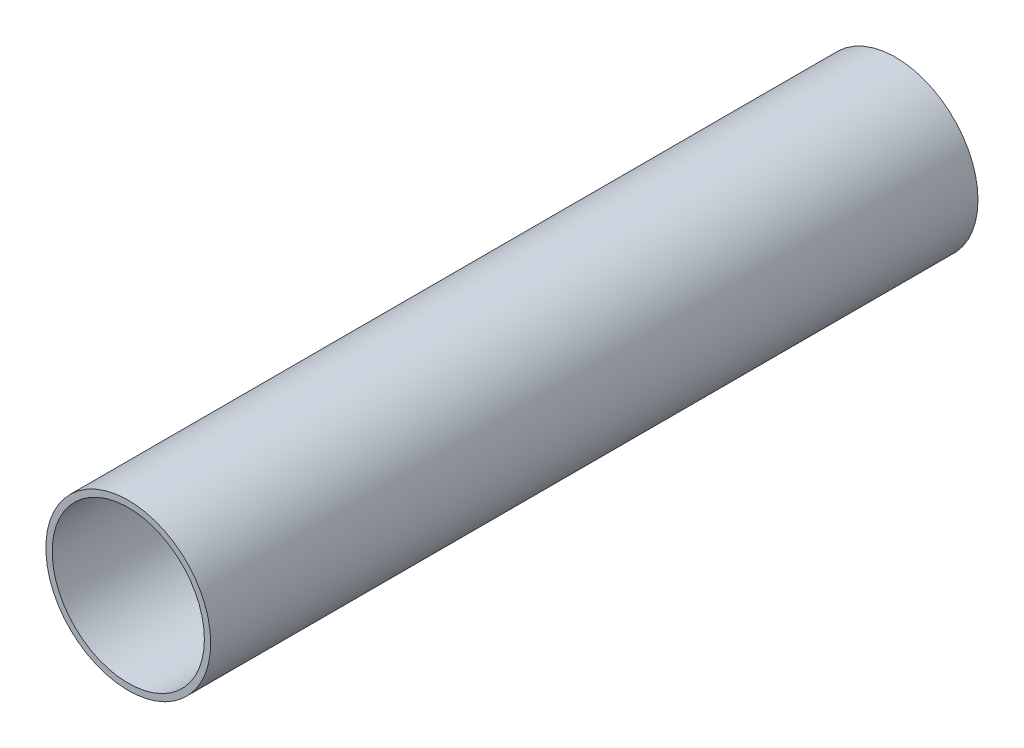
ISO-10303-21;
HEADER;
FILE_DESCRIPTION(('STEP AP214'),'2;1');
FILE_NAME('part.step','',(''),(''),'','','');
FILE_SCHEMA(('AUTOMOTIVE_DESIGN { 1 0 10303 214 1 1 1 1 }'));
ENDSEC;
DATA;
#1=APPLICATION_CONTEXT('core data for automotive mechanical design processes');
#2=APPLICATION_PROTOCOL_DEFINITION('international standard','automotive_design',2000,#1);
#3=PRODUCT_CONTEXT('',#1,'mechanical');
#4=PRODUCT('Part','Part','',(#3));
#5=PRODUCT_RELATED_PRODUCT_CATEGORY('part','',(#4));
#6=PRODUCT_DEFINITION_FORMATION('','',#4);
#7=PRODUCT_DEFINITION_CONTEXT('part definition',#1,'design');
#8=PRODUCT_DEFINITION('design','',#6,#7);
#9=PRODUCT_DEFINITION_SHAPE('','',#8);
#10=(LENGTH_UNIT() NAMED_UNIT(*) SI_UNIT(.MILLI.,.METRE.));
#11=(NAMED_UNIT(*) PLANE_ANGLE_UNIT() SI_UNIT($,.RADIAN.));
#12=(NAMED_UNIT(*) SI_UNIT($,.STERADIAN.) SOLID_ANGLE_UNIT());
#13=UNCERTAINTY_MEASURE_WITH_UNIT(LENGTH_MEASURE(1.E-05),#10,'distance_accuracy_value','');
#14=(GEOMETRIC_REPRESENTATION_CONTEXT(3) GLOBAL_UNCERTAINTY_ASSIGNED_CONTEXT((#13)) GLOBAL_UNIT_ASSIGNED_CONTEXT((#10,
#11,#12)) REPRESENTATION_CONTEXT('',''));
#15=CARTESIAN_POINT('',(0.,0.,0.));
#16=DIRECTION('',(0.,0.,1.));
#17=DIRECTION('',(1.,0.,0.));
#18=AXIS2_PLACEMENT_3D('',#15,#16,#17);
#19=CARTESIAN_POINT('',(0.,0.,242.));
#20=DIRECTION('',(0.,0.,1.));
#21=DIRECTION('',(1.,0.,0.));
#22=AXIS2_PLACEMENT_3D('',#19,#20,#21);
#23=PLANE('',#22);
#24=CARTESIAN_POINT('',(0.,0.,242.));
#25=DIRECTION('',(0.,0.,1.));
#26=DIRECTION('',(1.,0.,0.));
#27=AXIS2_PLACEMENT_3D('',#24,#25,#26);
#28=CIRCLE('',#27,26.);
#29=CARTESIAN_POINT('',(26.,0.,242.));
#30=VERTEX_POINT('',#29);
#31=EDGE_CURVE('E10',#30,#30,#28,.T.);
#32=ORIENTED_EDGE('',*,*,#31,.T.);
#33=EDGE_LOOP('',(#32));
#34=FACE_BOUND('',#33,.T.);
#35=CARTESIAN_POINT('',(0.,0.,242.));
#36=DIRECTION('',(0.,0.,1.));
#37=DIRECTION('',(1.,0.,0.));
#38=AXIS2_PLACEMENT_3D('',#35,#36,#37);
#39=CIRCLE('',#38,24.);
#40=CARTESIAN_POINT('',(24.,0.,242.));
#41=VERTEX_POINT('',#40);
#42=EDGE_CURVE('E52',#41,#41,#39,.T.);
#43=ORIENTED_EDGE('',*,*,#42,.F.);
#44=EDGE_LOOP('',(#43));
#45=FACE_BOUND('',#44,.T.);
#46=ADVANCED_FACE('F38',(#34,#45),#23,.T.);
#47=CARTESIAN_POINT('',(0.,0.,0.));
#48=DIRECTION('',(0.,0.,1.));
#49=DIRECTION('',(1.,0.,0.));
#50=AXIS2_PLACEMENT_3D('',#47,#48,#49);
#51=PLANE('',#50);
#52=CARTESIAN_POINT('',(0.,0.,0.));
#53=DIRECTION('',(0.,0.,1.));
#54=DIRECTION('',(1.,0.,0.));
#55=AXIS2_PLACEMENT_3D('',#52,#53,#54);
#56=CIRCLE('',#55,26.);
#57=CARTESIAN_POINT('',(26.,0.,0.));
#58=VERTEX_POINT('',#57);
#59=EDGE_CURVE('E42',#58,#58,#56,.T.);
#60=ORIENTED_EDGE('',*,*,#59,.F.);
#61=EDGE_LOOP('',(#60));
#62=FACE_BOUND('',#61,.T.);
#63=CARTESIAN_POINT('',(0.,0.,0.));
#64=DIRECTION('',(0.,0.,1.));
#65=DIRECTION('',(1.,0.,0.));
#66=AXIS2_PLACEMENT_3D('',#63,#64,#65);
#67=CIRCLE('',#66,24.);
#68=CARTESIAN_POINT('',(24.,0.,0.));
#69=VERTEX_POINT('',#68);
#70=EDGE_CURVE('E54',#69,#69,#67,.T.);
#71=ORIENTED_EDGE('',*,*,#70,.T.);
#72=EDGE_LOOP('',(#71));
#73=FACE_BOUND('',#72,.T.);
#74=ADVANCED_FACE('F65',(#62,#73),#51,.F.);
#75=CARTESIAN_POINT('',(0.,0.,242.));
#76=DIRECTION('',(0.,0.,-1.));
#77=DIRECTION('',(-1.,0.,0.));
#78=AXIS2_PLACEMENT_3D('',#75,#76,#77);
#79=CYLINDRICAL_SURFACE('',#78,26.);
#80=ORIENTED_EDGE('',*,*,#31,.F.);
#81=EDGE_LOOP('',(#80));
#82=FACE_BOUND('',#81,.T.);
#83=ORIENTED_EDGE('',*,*,#59,.T.);
#84=EDGE_LOOP('',(#83));
#85=FACE_BOUND('',#84,.T.);
#86=ADVANCED_FACE('F40',(#82,#85),#79,.T.);
#87=CARTESIAN_POINT('',(0.,0.,242.));
#88=DIRECTION('',(0.,0.,-1.));
#89=DIRECTION('',(-1.,0.,0.));
#90=AXIS2_PLACEMENT_3D('',#87,#88,#89);
#91=CYLINDRICAL_SURFACE('',#90,24.);
#92=ORIENTED_EDGE('',*,*,#42,.T.);
#93=EDGE_LOOP('',(#92));
#94=FACE_BOUND('',#93,.T.);
#95=ORIENTED_EDGE('',*,*,#70,.F.);
#96=EDGE_LOOP('',(#95));
#97=FACE_BOUND('',#96,.T.);
#98=ADVANCED_FACE('F61',(#94,#97),#91,.F.);
#99=CLOSED_SHELL('',(#46,#74,#86,#98));
#100=MANIFOLD_SOLID_BREP('B2',#99);
#101=ADVANCED_BREP_SHAPE_REPRESENTATION('',(#18,#100),#14);
#102=SHAPE_DEFINITION_REPRESENTATION(#9,#101);
ENDSEC;
END-ISO-10303-21;
